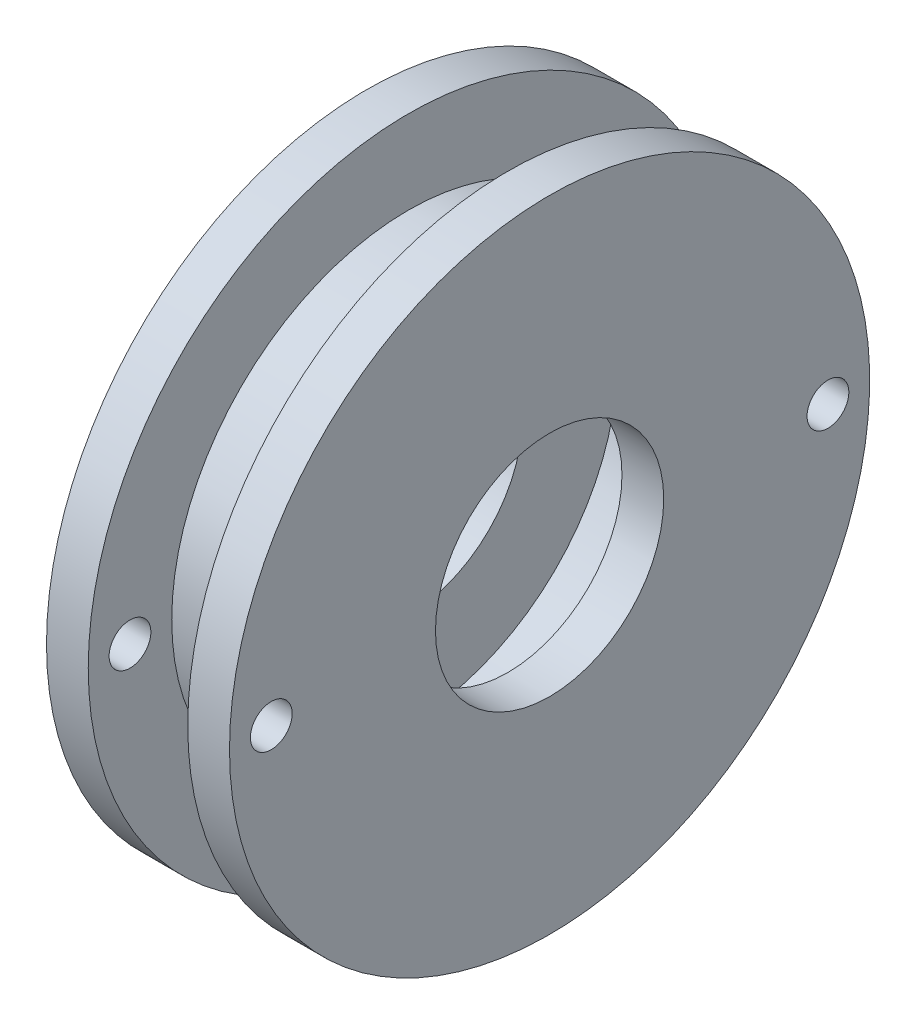
ISO-10303-21;
HEADER;
FILE_DESCRIPTION(('STEP AP214'),'2;1');
FILE_NAME('part.step','',(''),(''),'','','');
FILE_SCHEMA(('AUTOMOTIVE_DESIGN { 1 0 10303 214 1 1 1 1 }'));
ENDSEC;
DATA;
#1=APPLICATION_CONTEXT('core data for automotive mechanical design processes');
#2=APPLICATION_PROTOCOL_DEFINITION('international standard','automotive_design',2000,#1);
#3=PRODUCT_CONTEXT('',#1,'mechanical');
#4=PRODUCT('Part','Part','',(#3));
#5=PRODUCT_RELATED_PRODUCT_CATEGORY('part','',(#4));
#6=PRODUCT_DEFINITION_FORMATION('','',#4);
#7=PRODUCT_DEFINITION_CONTEXT('part definition',#1,'design');
#8=PRODUCT_DEFINITION('design','',#6,#7);
#9=PRODUCT_DEFINITION_SHAPE('','',#8);
#10=(LENGTH_UNIT() NAMED_UNIT(*) SI_UNIT(.MILLI.,.METRE.));
#11=(NAMED_UNIT(*) PLANE_ANGLE_UNIT() SI_UNIT($,.RADIAN.));
#12=(NAMED_UNIT(*) SI_UNIT($,.STERADIAN.) SOLID_ANGLE_UNIT());
#13=UNCERTAINTY_MEASURE_WITH_UNIT(LENGTH_MEASURE(1.E-05),#10,'distance_accuracy_value','');
#14=(GEOMETRIC_REPRESENTATION_CONTEXT(3) GLOBAL_UNCERTAINTY_ASSIGNED_CONTEXT((#13)) GLOBAL_UNIT_ASSIGNED_CONTEXT((#10,
#11,#12)) REPRESENTATION_CONTEXT('',''));
#15=CARTESIAN_POINT('',(0.,0.,0.));
#16=DIRECTION('',(0.,0.,1.));
#17=DIRECTION('',(1.,0.,0.));
#18=AXIS2_PLACEMENT_3D('',#15,#16,#17);
#19=CARTESIAN_POINT('',(3.575,15.,0.));
#20=DIRECTION('',(1.,0.,0.));
#21=DIRECTION('',(0.,0.,-1.));
#22=AXIS2_PLACEMENT_3D('',#19,#20,#21);
#23=PLANE('',#22);
#24=CARTESIAN_POINT('',(3.575,0.,0.));
#25=DIRECTION('',(-1.,0.,0.));
#26=DIRECTION('',(0.,0.,1.));
#27=AXIS2_PLACEMENT_3D('',#24,#25,#26);
#28=CIRCLE('',#27,8.2);
#29=CARTESIAN_POINT('',(3.575,0.,8.2));
#30=VERTEX_POINT('',#29);
#31=EDGE_CURVE('E10',#30,#30,#28,.T.);
#32=ORIENTED_EDGE('',*,*,#31,.F.);
#33=EDGE_LOOP('',(#32));
#34=FACE_BOUND('',#33,.T.);
#35=CARTESIAN_POINT('',(3.575,0.,0.));
#36=DIRECTION('',(-1.,0.,0.));
#37=DIRECTION('',(0.,0.,1.));
#38=AXIS2_PLACEMENT_3D('',#35,#36,#37);
#39=CIRCLE('',#38,15.);
#40=CARTESIAN_POINT('',(3.575,0.,15.));
#41=VERTEX_POINT('',#40);
#42=EDGE_CURVE('E71',#41,#41,#39,.T.);
#43=ORIENTED_EDGE('',*,*,#42,.T.);
#44=EDGE_LOOP('',(#43));
#45=FACE_BOUND('',#44,.T.);
#46=ADVANCED_FACE('F31',(#34,#45),#23,.F.);
#47=CARTESIAN_POINT('',(0.,0.,0.));
#48=DIRECTION('',(-1.,0.,0.));
#49=DIRECTION('',(0.,0.,1.));
#50=AXIS2_PLACEMENT_3D('',#47,#48,#49);
#51=CYLINDRICAL_SURFACE('',#50,8.2);
#52=CARTESIAN_POINT('',(6.575,0.,0.));
#53=DIRECTION('',(-1.,0.,0.));
#54=DIRECTION('',(0.,0.,1.));
#55=AXIS2_PLACEMENT_3D('',#52,#53,#54);
#56=CIRCLE('',#55,8.2);
#57=CARTESIAN_POINT('',(6.575,0.,8.2));
#58=VERTEX_POINT('',#57);
#59=EDGE_CURVE('E37',#58,#58,#56,.T.);
#60=ORIENTED_EDGE('',*,*,#59,.F.);
#61=EDGE_LOOP('',(#60));
#62=FACE_BOUND('',#61,.T.);
#63=ORIENTED_EDGE('',*,*,#31,.T.);
#64=EDGE_LOOP('',(#63));
#65=FACE_BOUND('',#64,.T.);
#66=ADVANCED_FACE('F147',(#62,#65),#51,.F.);
#67=CARTESIAN_POINT('',(6.575,8.2,0.));
#68=DIRECTION('',(-1.,0.,0.));
#69=DIRECTION('',(0.,0.,1.));
#70=AXIS2_PLACEMENT_3D('',#67,#68,#69);
#71=PLANE('',#70);
#72=CARTESIAN_POINT('',(6.575,0.,20.));
#73=DIRECTION('',(-1.,0.,0.));
#74=DIRECTION('',(0.,0.,1.));
#75=AXIS2_PLACEMENT_3D('',#72,#73,#74);
#76=CIRCLE('',#75,1.5);
#77=CARTESIAN_POINT('',(6.575,0.,21.5));
#78=VERTEX_POINT('',#77);
#79=EDGE_CURVE('E74',#78,#78,#76,.T.);
#80=ORIENTED_EDGE('',*,*,#79,.T.);
#81=EDGE_LOOP('',(#80));
#82=FACE_BOUND('',#81,.T.);
#83=CARTESIAN_POINT('',(6.575,0.,-20.));
#84=DIRECTION('',(-1.,0.,0.));
#85=DIRECTION('',(0.,0.,1.));
#86=AXIS2_PLACEMENT_3D('',#83,#84,#85);
#87=CIRCLE('',#86,1.5);
#88=CARTESIAN_POINT('',(6.575,0.,-18.5));
#89=VERTEX_POINT('',#88);
#90=EDGE_CURVE('E83',#89,#89,#87,.T.);
#91=ORIENTED_EDGE('',*,*,#90,.T.);
#92=EDGE_LOOP('',(#91));
#93=FACE_BOUND('',#92,.T.);
#94=CARTESIAN_POINT('',(6.575,0.,0.));
#95=DIRECTION('',(-1.,0.,0.));
#96=DIRECTION('',(0.,0.,1.));
#97=AXIS2_PLACEMENT_3D('',#94,#95,#96);
#98=CIRCLE('',#97,23.);
#99=CARTESIAN_POINT('',(6.575,0.,23.));
#100=VERTEX_POINT('',#99);
#101=EDGE_CURVE('E41',#100,#100,#98,.T.);
#102=ORIENTED_EDGE('',*,*,#101,.F.);
#103=EDGE_LOOP('',(#102));
#104=FACE_BOUND('',#103,.T.);
#105=ORIENTED_EDGE('',*,*,#59,.T.);
#106=EDGE_LOOP('',(#105));
#107=FACE_BOUND('',#106,.T.);
#108=ADVANCED_FACE('F142',(#82,#93,#104,#107),#71,.F.);
#109=CARTESIAN_POINT('',(0.,0.,0.));
#110=DIRECTION('',(-1.,0.,0.));
#111=DIRECTION('',(0.,0.,1.));
#112=AXIS2_PLACEMENT_3D('',#109,#110,#111);
#113=CYLINDRICAL_SURFACE('',#112,23.);
#114=CARTESIAN_POINT('',(3.575,0.,0.));
#115=DIRECTION('',(-1.,0.,0.));
#116=DIRECTION('',(0.,0.,1.));
#117=AXIS2_PLACEMENT_3D('',#114,#115,#116);
#118=CIRCLE('',#117,23.);
#119=CARTESIAN_POINT('',(3.575,0.,23.));
#120=VERTEX_POINT('',#119);
#121=EDGE_CURVE('E45',#120,#120,#118,.T.);
#122=ORIENTED_EDGE('',*,*,#121,.F.);
#123=EDGE_LOOP('',(#122));
#124=FACE_BOUND('',#123,.T.);
#125=ORIENTED_EDGE('',*,*,#101,.T.);
#126=EDGE_LOOP('',(#125));
#127=FACE_BOUND('',#126,.T.);
#128=ADVANCED_FACE('F135',(#124,#127),#113,.T.);
#129=CARTESIAN_POINT('',(3.575,23.,0.));
#130=DIRECTION('',(1.,0.,0.));
#131=DIRECTION('',(0.,0.,-1.));
#132=AXIS2_PLACEMENT_3D('',#129,#130,#131);
#133=PLANE('',#132);
#134=CARTESIAN_POINT('',(3.575,0.,20.));
#135=DIRECTION('',(1.,0.,0.));
#136=DIRECTION('',(0.,0.,-1.));
#137=AXIS2_PLACEMENT_3D('',#134,#135,#136);
#138=CIRCLE('',#137,1.5);
#139=CARTESIAN_POINT('',(3.575,0.,18.5));
#140=VERTEX_POINT('',#139);
#141=EDGE_CURVE('E77',#140,#140,#138,.T.);
#142=ORIENTED_EDGE('',*,*,#141,.T.);
#143=EDGE_LOOP('',(#142));
#144=FACE_BOUND('',#143,.T.);
#145=CARTESIAN_POINT('',(3.575,0.,-20.));
#146=DIRECTION('',(1.,0.,0.));
#147=DIRECTION('',(0.,0.,-1.));
#148=AXIS2_PLACEMENT_3D('',#145,#146,#147);
#149=CIRCLE('',#148,1.5);
#150=CARTESIAN_POINT('',(3.575,0.,-21.5));
#151=VERTEX_POINT('',#150);
#152=EDGE_CURVE('E86',#151,#151,#149,.T.);
#153=ORIENTED_EDGE('',*,*,#152,.T.);
#154=EDGE_LOOP('',(#153));
#155=FACE_BOUND('',#154,.T.);
#156=CARTESIAN_POINT('',(3.575,0.,0.));
#157=DIRECTION('',(-1.,0.,0.));
#158=DIRECTION('',(0.,0.,1.));
#159=AXIS2_PLACEMENT_3D('',#156,#157,#158);
#160=CIRCLE('',#159,17.);
#161=CARTESIAN_POINT('',(3.575,0.,17.));
#162=VERTEX_POINT('',#161);
#163=EDGE_CURVE('E50',#162,#162,#160,.T.);
#164=ORIENTED_EDGE('',*,*,#163,.F.);
#165=EDGE_LOOP('',(#164));
#166=FACE_BOUND('',#165,.T.);
#167=ORIENTED_EDGE('',*,*,#121,.T.);
#168=EDGE_LOOP('',(#167));
#169=FACE_BOUND('',#168,.T.);
#170=ADVANCED_FACE('F129',(#144,#155,#166,#169),#133,.F.);
#171=CARTESIAN_POINT('',(0.,0.,0.));
#172=DIRECTION('',(-1.,0.,0.));
#173=DIRECTION('',(0.,0.,1.));
#174=AXIS2_PLACEMENT_3D('',#171,#172,#173);
#175=CYLINDRICAL_SURFACE('',#174,17.);
#176=CARTESIAN_POINT('',(-3.575,0.,0.));
#177=DIRECTION('',(-1.,0.,0.));
#178=DIRECTION('',(0.,0.,1.));
#179=AXIS2_PLACEMENT_3D('',#176,#177,#178);
#180=CIRCLE('',#179,17.);
#181=CARTESIAN_POINT('',(-3.575,0.,17.));
#182=VERTEX_POINT('',#181);
#183=EDGE_CURVE('E53',#182,#182,#180,.T.);
#184=ORIENTED_EDGE('',*,*,#183,.F.);
#185=EDGE_LOOP('',(#184));
#186=FACE_BOUND('',#185,.T.);
#187=ORIENTED_EDGE('',*,*,#163,.T.);
#188=EDGE_LOOP('',(#187));
#189=FACE_BOUND('',#188,.T.);
#190=ADVANCED_FACE('F122',(#186,#189),#175,.T.);
#191=CARTESIAN_POINT('',(-3.575,23.,0.));
#192=DIRECTION('',(-1.,0.,0.));
#193=DIRECTION('',(0.,0.,1.));
#194=AXIS2_PLACEMENT_3D('',#191,#192,#193);
#195=PLANE('',#194);
#196=CARTESIAN_POINT('',(-3.575,0.,20.));
#197=DIRECTION('',(-1.,0.,0.));
#198=DIRECTION('',(0.,0.,1.));
#199=AXIS2_PLACEMENT_3D('',#196,#197,#198);
#200=CIRCLE('',#199,1.5);
#201=CARTESIAN_POINT('',(-3.575,0.,21.5));
#202=VERTEX_POINT('',#201);
#203=EDGE_CURVE('E80',#202,#202,#200,.T.);
#204=ORIENTED_EDGE('',*,*,#203,.T.);
#205=EDGE_LOOP('',(#204));
#206=FACE_BOUND('',#205,.T.);
#207=CARTESIAN_POINT('',(-3.575,0.,-20.));
#208=DIRECTION('',(-1.,0.,0.));
#209=DIRECTION('',(0.,0.,1.));
#210=AXIS2_PLACEMENT_3D('',#207,#208,#209);
#211=CIRCLE('',#210,1.5);
#212=CARTESIAN_POINT('',(-3.575,0.,-18.5));
#213=VERTEX_POINT('',#212);
#214=EDGE_CURVE('E89',#213,#213,#211,.T.);
#215=ORIENTED_EDGE('',*,*,#214,.T.);
#216=EDGE_LOOP('',(#215));
#217=FACE_BOUND('',#216,.T.);
#218=CARTESIAN_POINT('',(-3.575,0.,0.));
#219=DIRECTION('',(-1.,0.,0.));
#220=DIRECTION('',(0.,0.,1.));
#221=AXIS2_PLACEMENT_3D('',#218,#219,#220);
#222=CIRCLE('',#221,23.);
#223=CARTESIAN_POINT('',(-3.575,0.,23.));
#224=VERTEX_POINT('',#223);
#225=EDGE_CURVE('E56',#224,#224,#222,.T.);
#226=ORIENTED_EDGE('',*,*,#225,.F.);
#227=EDGE_LOOP('',(#226));
#228=FACE_BOUND('',#227,.T.);
#229=ORIENTED_EDGE('',*,*,#183,.T.);
#230=EDGE_LOOP('',(#229));
#231=FACE_BOUND('',#230,.T.);
#232=ADVANCED_FACE('F116',(#206,#217,#228,#231),#195,.F.);
#233=CARTESIAN_POINT('',(0.,0.,0.));
#234=DIRECTION('',(-1.,0.,0.));
#235=DIRECTION('',(0.,0.,1.));
#236=AXIS2_PLACEMENT_3D('',#233,#234,#235);
#237=CYLINDRICAL_SURFACE('',#236,23.);
#238=CARTESIAN_POINT('',(-6.575,0.,0.));
#239=DIRECTION('',(-1.,0.,0.));
#240=DIRECTION('',(0.,0.,1.));
#241=AXIS2_PLACEMENT_3D('',#238,#239,#240);
#242=CIRCLE('',#241,23.);
#243=CARTESIAN_POINT('',(-6.575,0.,23.));
#244=VERTEX_POINT('',#243);
#245=EDGE_CURVE('E59',#244,#244,#242,.T.);
#246=ORIENTED_EDGE('',*,*,#245,.F.);
#247=EDGE_LOOP('',(#246));
#248=FACE_BOUND('',#247,.T.);
#249=ORIENTED_EDGE('',*,*,#225,.T.);
#250=EDGE_LOOP('',(#249));
#251=FACE_BOUND('',#250,.T.);
#252=ADVANCED_FACE('F106',(#248,#251),#237,.T.);
#253=CARTESIAN_POINT('',(-6.575,8.2,0.));
#254=DIRECTION('',(1.,0.,0.));
#255=DIRECTION('',(0.,0.,-1.));
#256=AXIS2_PLACEMENT_3D('',#253,#254,#255);
#257=PLANE('',#256);
#258=CARTESIAN_POINT('',(-6.575,0.,20.));
#259=DIRECTION('',(-1.,0.,0.));
#260=DIRECTION('',(0.,0.,1.));
#261=AXIS2_PLACEMENT_3D('',#258,#259,#260);
#262=CIRCLE('',#261,1.5);
#263=CARTESIAN_POINT('',(-6.575,0.,21.5));
#264=VERTEX_POINT('',#263);
#265=EDGE_CURVE('E92',#264,#264,#262,.T.);
#266=ORIENTED_EDGE('',*,*,#265,.F.);
#267=EDGE_LOOP('',(#266));
#268=FACE_BOUND('',#267,.T.);
#269=CARTESIAN_POINT('',(-6.575,0.,-20.));
#270=DIRECTION('',(-1.,0.,0.));
#271=DIRECTION('',(0.,0.,-1.));
#272=AXIS2_PLACEMENT_3D('',#269,#270,#271);
#273=CIRCLE('',#272,1.5);
#274=CARTESIAN_POINT('',(-6.575,0.,-21.5));
#275=VERTEX_POINT('',#274);
#276=EDGE_CURVE('E93',#275,#275,#273,.T.);
#277=ORIENTED_EDGE('',*,*,#276,.F.);
#278=EDGE_LOOP('',(#277));
#279=FACE_BOUND('',#278,.T.);
#280=CARTESIAN_POINT('',(-6.575,0.,0.));
#281=DIRECTION('',(-1.,0.,0.));
#282=DIRECTION('',(0.,0.,1.));
#283=AXIS2_PLACEMENT_3D('',#280,#281,#282);
#284=CIRCLE('',#283,8.2);
#285=CARTESIAN_POINT('',(-6.575,0.,8.2));
#286=VERTEX_POINT('',#285);
#287=EDGE_CURVE('E62',#286,#286,#284,.T.);
#288=ORIENTED_EDGE('',*,*,#287,.F.);
#289=EDGE_LOOP('',(#288));
#290=FACE_BOUND('',#289,.T.);
#291=ORIENTED_EDGE('',*,*,#245,.T.);
#292=EDGE_LOOP('',(#291));
#293=FACE_BOUND('',#292,.T.);
#294=ADVANCED_FACE('F102',(#268,#279,#290,#293),#257,.F.);
#295=CARTESIAN_POINT('',(0.,0.,0.));
#296=DIRECTION('',(-1.,0.,0.));
#297=DIRECTION('',(0.,0.,1.));
#298=AXIS2_PLACEMENT_3D('',#295,#296,#297);
#299=CYLINDRICAL_SURFACE('',#298,8.2);
#300=CARTESIAN_POINT('',(-3.575,0.,0.));
#301=DIRECTION('',(-1.,0.,0.));
#302=DIRECTION('',(0.,0.,1.));
#303=AXIS2_PLACEMENT_3D('',#300,#301,#302);
#304=CIRCLE('',#303,8.2);
#305=CARTESIAN_POINT('',(-3.575,0.,8.2));
#306=VERTEX_POINT('',#305);
#307=EDGE_CURVE('E65',#306,#306,#304,.T.);
#308=ORIENTED_EDGE('',*,*,#307,.F.);
#309=EDGE_LOOP('',(#308));
#310=FACE_BOUND('',#309,.T.);
#311=ORIENTED_EDGE('',*,*,#287,.T.);
#312=EDGE_LOOP('',(#311));
#313=FACE_BOUND('',#312,.T.);
#314=ADVANCED_FACE('F105',(#310,#313),#299,.F.);
#315=CARTESIAN_POINT('',(-3.575,15.,0.));
#316=DIRECTION('',(-1.,0.,0.));
#317=DIRECTION('',(0.,0.,1.));
#318=AXIS2_PLACEMENT_3D('',#315,#316,#317);
#319=PLANE('',#318);
#320=CARTESIAN_POINT('',(-3.575,0.,0.));
#321=DIRECTION('',(-1.,0.,0.));
#322=DIRECTION('',(0.,0.,1.));
#323=AXIS2_PLACEMENT_3D('',#320,#321,#322);
#324=CIRCLE('',#323,15.);
#325=CARTESIAN_POINT('',(-3.575,0.,15.));
#326=VERTEX_POINT('',#325);
#327=EDGE_CURVE('E68',#326,#326,#324,.T.);
#328=ORIENTED_EDGE('',*,*,#327,.F.);
#329=EDGE_LOOP('',(#328));
#330=FACE_BOUND('',#329,.T.);
#331=ORIENTED_EDGE('',*,*,#307,.T.);
#332=EDGE_LOOP('',(#331));
#333=FACE_BOUND('',#332,.T.);
#334=ADVANCED_FACE('F166',(#330,#333),#319,.F.);
#335=CARTESIAN_POINT('',(0.,0.,0.));
#336=DIRECTION('',(-1.,0.,0.));
#337=DIRECTION('',(0.,0.,1.));
#338=AXIS2_PLACEMENT_3D('',#335,#336,#337);
#339=CYLINDRICAL_SURFACE('',#338,15.);
#340=ORIENTED_EDGE('',*,*,#42,.F.);
#341=EDGE_LOOP('',(#340));
#342=FACE_BOUND('',#341,.T.);
#343=ORIENTED_EDGE('',*,*,#327,.T.);
#344=EDGE_LOOP('',(#343));
#345=FACE_BOUND('',#344,.T.);
#346=ADVANCED_FACE('F162',(#342,#345),#339,.F.);
#347=CARTESIAN_POINT('',(23.425,0.,-20.));
#348=DIRECTION('',(-1.,0.,0.));
#349=DIRECTION('',(0.,0.,1.));
#350=AXIS2_PLACEMENT_3D('',#347,#348,#349);
#351=CYLINDRICAL_SURFACE('',#350,1.5);
#352=ORIENTED_EDGE('',*,*,#276,.T.);
#353=EDGE_LOOP('',(#352));
#354=FACE_BOUND('',#353,.T.);
#355=ORIENTED_EDGE('',*,*,#214,.F.);
#356=EDGE_LOOP('',(#355));
#357=FACE_BOUND('',#356,.T.);
#358=ADVANCED_FACE('F165',(#354,#357),#351,.F.);
#359=CARTESIAN_POINT('',(23.425,0.,20.));
#360=DIRECTION('',(-1.,0.,0.));
#361=DIRECTION('',(0.,0.,1.));
#362=AXIS2_PLACEMENT_3D('',#359,#360,#361);
#363=CYLINDRICAL_SURFACE('',#362,1.5);
#364=ORIENTED_EDGE('',*,*,#265,.T.);
#365=EDGE_LOOP('',(#364));
#366=FACE_BOUND('',#365,.T.);
#367=ORIENTED_EDGE('',*,*,#203,.F.);
#368=EDGE_LOOP('',(#367));
#369=FACE_BOUND('',#368,.T.);
#370=ADVANCED_FACE('F99',(#366,#369),#363,.F.);
#371=ORIENTED_EDGE('',*,*,#152,.F.);
#372=EDGE_LOOP('',(#371));
#373=FACE_BOUND('',#372,.T.);
#374=ORIENTED_EDGE('',*,*,#90,.F.);
#375=EDGE_LOOP('',(#374));
#376=FACE_BOUND('',#375,.T.);
#377=ADVANCED_FACE('F181',(#373,#376),#351,.F.);
#378=ORIENTED_EDGE('',*,*,#141,.F.);
#379=EDGE_LOOP('',(#378));
#380=FACE_BOUND('',#379,.T.);
#381=ORIENTED_EDGE('',*,*,#79,.F.);
#382=EDGE_LOOP('',(#381));
#383=FACE_BOUND('',#382,.T.);
#384=ADVANCED_FACE('F184',(#380,#383),#363,.F.);
#385=CLOSED_SHELL('',(#46,#66,#108,#128,#170,#190,#232,#252,#294,#314,#334,#346,#358,#370,#377,#384));
#386=MANIFOLD_SOLID_BREP('B2',#385);
#387=ADVANCED_BREP_SHAPE_REPRESENTATION('',(#18,#386),#14);
#388=SHAPE_DEFINITION_REPRESENTATION(#9,#387);
ENDSEC;
END-ISO-10303-21;
